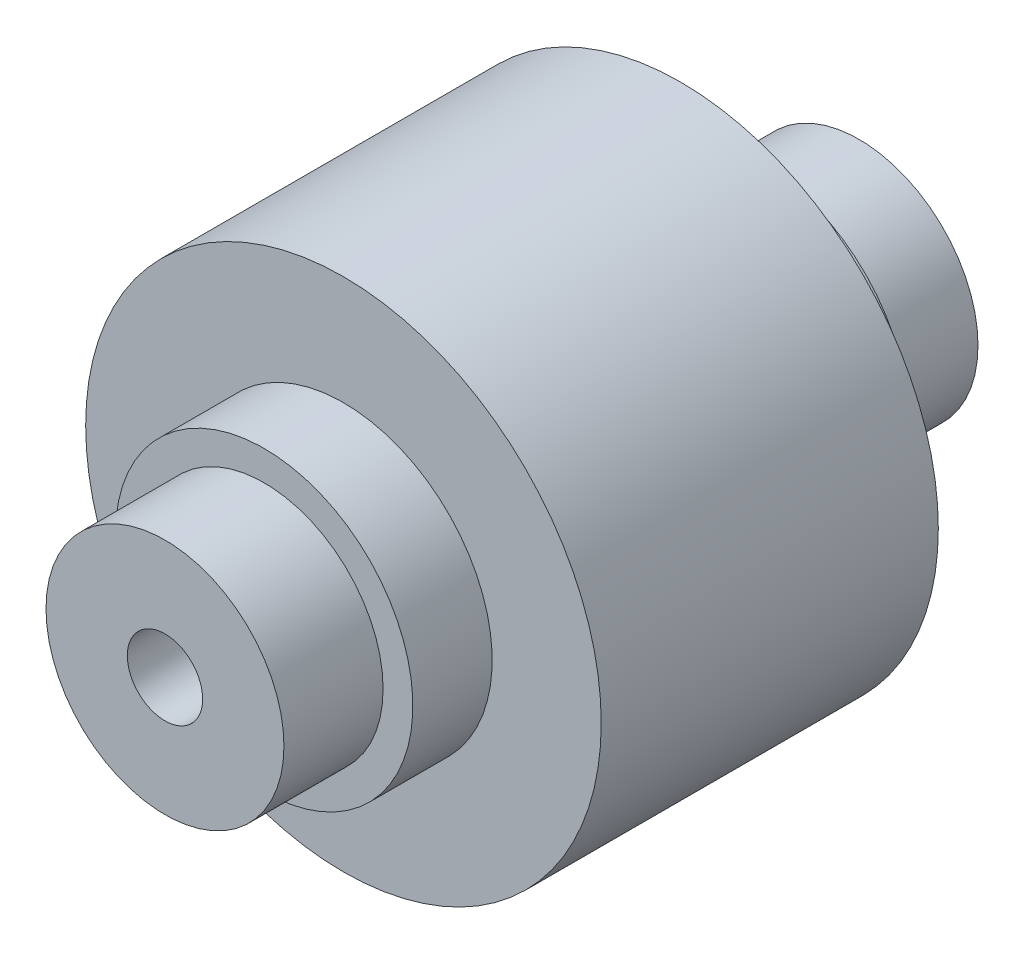
ISO-10303-21;
HEADER;
FILE_DESCRIPTION(('STEP AP214'),'2;1');
FILE_NAME('part.step','',(''),(''),'','','');
FILE_SCHEMA(('AUTOMOTIVE_DESIGN { 1 0 10303 214 1 1 1 1 }'));
ENDSEC;
DATA;
#1=APPLICATION_CONTEXT('core data for automotive mechanical design processes');
#2=APPLICATION_PROTOCOL_DEFINITION('international standard','automotive_design',2000,#1);
#3=PRODUCT_CONTEXT('',#1,'mechanical');
#4=PRODUCT('Part','Part','',(#3));
#5=PRODUCT_RELATED_PRODUCT_CATEGORY('part','',(#4));
#6=PRODUCT_DEFINITION_FORMATION('','',#4);
#7=PRODUCT_DEFINITION_CONTEXT('part definition',#1,'design');
#8=PRODUCT_DEFINITION('design','',#6,#7);
#9=PRODUCT_DEFINITION_SHAPE('','',#8);
#10=(LENGTH_UNIT() NAMED_UNIT(*) SI_UNIT(.MILLI.,.METRE.));
#11=(NAMED_UNIT(*) PLANE_ANGLE_UNIT() SI_UNIT($,.RADIAN.));
#12=(NAMED_UNIT(*) SI_UNIT($,.STERADIAN.) SOLID_ANGLE_UNIT());
#13=UNCERTAINTY_MEASURE_WITH_UNIT(LENGTH_MEASURE(1.E-05),#10,'distance_accuracy_value','');
#14=(GEOMETRIC_REPRESENTATION_CONTEXT(3) GLOBAL_UNCERTAINTY_ASSIGNED_CONTEXT((#13)) GLOBAL_UNIT_ASSIGNED_CONTEXT((#10,
#11,#12)) REPRESENTATION_CONTEXT('',''));
#15=CARTESIAN_POINT('',(0.,0.,0.));
#16=DIRECTION('',(0.,0.,1.));
#17=DIRECTION('',(1.,0.,0.));
#18=AXIS2_PLACEMENT_3D('',#15,#16,#17);
#19=CARTESIAN_POINT('',(6.00000000000001,0.,7.69072305839558E-10));
#20=DIRECTION('',(0.,0.,1.));
#21=DIRECTION('',(1.,0.,0.));
#22=AXIS2_PLACEMENT_3D('',#19,#20,#21);
#23=PLANE('',#22);
#24=CARTESIAN_POINT('',(0.,0.,7.69072305839558E-10));
#25=DIRECTION('',(0.,0.,1.));
#26=DIRECTION('',(1.,0.,0.));
#27=AXIS2_PLACEMENT_3D('',#24,#25,#26);
#28=CIRCLE('',#27,1.9);
#29=CARTESIAN_POINT('',(1.9,0.,7.69072305839558E-10));
#30=VERTEX_POINT('',#29);
#31=EDGE_CURVE('E69',#30,#30,#28,.T.);
#32=ORIENTED_EDGE('',*,*,#31,.T.);
#33=EDGE_LOOP('',(#32));
#34=FACE_BOUND('',#33,.T.);
#35=CARTESIAN_POINT('',(0.,0.,7.69072305839558E-10));
#36=DIRECTION('',(0.,0.,-1.));
#37=DIRECTION('',(-1.,0.,0.));
#38=AXIS2_PLACEMENT_3D('',#35,#36,#37);
#39=CIRCLE('',#38,5.99999999999999);
#40=CARTESIAN_POINT('',(-5.99999999999998,0.,7.69072305839558E-10));
#41=VERTEX_POINT('',#40);
#42=EDGE_CURVE('E66',#41,#41,#39,.T.);
#43=ORIENTED_EDGE('',*,*,#42,.T.);
#44=EDGE_LOOP('',(#43));
#45=FACE_BOUND('',#44,.T.);
#46=ADVANCED_FACE('F32',(#34,#45),#23,.F.);
#47=CARTESIAN_POINT('',(6.00000000000001,0.,35.0000000000258));
#48=DIRECTION('',(0.,0.,-1.));
#49=DIRECTION('',(-1.,0.,0.));
#50=AXIS2_PLACEMENT_3D('',#47,#48,#49);
#51=PLANE('',#50);
#52=CARTESIAN_POINT('',(0.,0.,35.0000000000258));
#53=DIRECTION('',(0.,0.,1.));
#54=DIRECTION('',(1.,0.,0.));
#55=AXIS2_PLACEMENT_3D('',#52,#53,#54);
#56=CIRCLE('',#55,1.9);
#57=CARTESIAN_POINT('',(1.9,0.,35.0000000000258));
#58=VERTEX_POINT('',#57);
#59=EDGE_CURVE('E72',#58,#58,#56,.T.);
#60=ORIENTED_EDGE('',*,*,#59,.F.);
#61=EDGE_LOOP('',(#60));
#62=FACE_BOUND('',#61,.T.);
#63=CARTESIAN_POINT('',(0.,0.,35.0000000000258));
#64=DIRECTION('',(0.,0.,-1.));
#65=DIRECTION('',(-1.,0.,0.));
#66=AXIS2_PLACEMENT_3D('',#63,#64,#65);
#67=CIRCLE('',#66,5.99999999999999);
#68=CARTESIAN_POINT('',(-5.99999999999998,0.,35.0000000000258));
#69=VERTEX_POINT('',#68);
#70=EDGE_CURVE('E10',#69,#69,#67,.T.);
#71=ORIENTED_EDGE('',*,*,#70,.F.);
#72=EDGE_LOOP('',(#71));
#73=FACE_BOUND('',#72,.T.);
#74=ADVANCED_FACE('F79',(#62,#73),#51,.F.);
#75=CARTESIAN_POINT('',(0.,0.,7.69072305839558E-10));
#76=DIRECTION('',(0.,0.,-1.));
#77=DIRECTION('',(-1.,0.,0.));
#78=AXIS2_PLACEMENT_3D('',#75,#76,#77);
#79=CYLINDRICAL_SURFACE('',#78,5.99999999999999);
#80=CARTESIAN_POINT('',(0.,0.,30.0000000003974));
#81=DIRECTION('',(0.,0.,-1.));
#82=DIRECTION('',(-1.,0.,0.));
#83=AXIS2_PLACEMENT_3D('',#80,#81,#82);
#84=CIRCLE('',#83,5.99999999999999);
#85=CARTESIAN_POINT('',(-5.99999999999998,0.,30.0000000003974));
#86=VERTEX_POINT('',#85);
#87=EDGE_CURVE('E38',#86,#86,#84,.T.);
#88=ORIENTED_EDGE('',*,*,#87,.F.);
#89=EDGE_LOOP('',(#88));
#90=FACE_BOUND('',#89,.T.);
#91=ORIENTED_EDGE('',*,*,#70,.T.);
#92=EDGE_LOOP('',(#91));
#93=FACE_BOUND('',#92,.T.);
#94=ADVANCED_FACE('F82',(#90,#93),#79,.T.);
#95=CARTESIAN_POINT('',(7.50000000000001,0.,30.0000000003974));
#96=DIRECTION('',(0.,0.,-1.));
#97=DIRECTION('',(-1.,0.,0.));
#98=AXIS2_PLACEMENT_3D('',#95,#96,#97);
#99=PLANE('',#98);
#100=CARTESIAN_POINT('',(0.,0.,30.0000000003974));
#101=DIRECTION('',(0.,0.,-1.));
#102=DIRECTION('',(-1.,0.,0.));
#103=AXIS2_PLACEMENT_3D('',#100,#101,#102);
#104=CIRCLE('',#103,7.5);
#105=CARTESIAN_POINT('',(-7.49999999999998,0.,30.0000000003974));
#106=VERTEX_POINT('',#105);
#107=EDGE_CURVE('E42',#106,#106,#104,.T.);
#108=ORIENTED_EDGE('',*,*,#107,.F.);
#109=EDGE_LOOP('',(#108));
#110=FACE_BOUND('',#109,.T.);
#111=ORIENTED_EDGE('',*,*,#87,.T.);
#112=EDGE_LOOP('',(#111));
#113=FACE_BOUND('',#112,.T.);
#114=ADVANCED_FACE('F87',(#110,#113),#99,.F.);
#115=CARTESIAN_POINT('',(0.,0.,7.69072305839558E-10));
#116=DIRECTION('',(0.,0.,-1.));
#117=DIRECTION('',(-1.,0.,0.));
#118=AXIS2_PLACEMENT_3D('',#115,#116,#117);
#119=CYLINDRICAL_SURFACE('',#118,7.5);
#120=CARTESIAN_POINT('',(0.,0.,26.0000000003974));
#121=DIRECTION('',(0.,0.,-1.));
#122=DIRECTION('',(-1.,0.,0.));
#123=AXIS2_PLACEMENT_3D('',#120,#121,#122);
#124=CIRCLE('',#123,7.5);
#125=CARTESIAN_POINT('',(-7.49999999999998,0.,26.0000000003974));
#126=VERTEX_POINT('',#125);
#127=EDGE_CURVE('E46',#126,#126,#124,.T.);
#128=ORIENTED_EDGE('',*,*,#127,.F.);
#129=EDGE_LOOP('',(#128));
#130=FACE_BOUND('',#129,.T.);
#131=ORIENTED_EDGE('',*,*,#107,.T.);
#132=EDGE_LOOP('',(#131));
#133=FACE_BOUND('',#132,.T.);
#134=ADVANCED_FACE('F94',(#130,#133),#119,.T.);
#135=CARTESIAN_POINT('',(9.00000000000001,0.,26.0000000003974));
#136=DIRECTION('',(0.,0.,-1.));
#137=DIRECTION('',(-1.,0.,0.));
#138=AXIS2_PLACEMENT_3D('',#135,#136,#137);
#139=PLANE('',#138);
#140=CARTESIAN_POINT('',(0.,0.,26.0000000003974));
#141=DIRECTION('',(0.,0.,-1.));
#142=DIRECTION('',(-1.,0.,0.));
#143=AXIS2_PLACEMENT_3D('',#140,#141,#142);
#144=CIRCLE('',#143,13.);
#145=CARTESIAN_POINT('',(-13.,0.,26.0000000003974));
#146=VERTEX_POINT('',#145);
#147=EDGE_CURVE('E51',#146,#146,#144,.T.);
#148=ORIENTED_EDGE('',*,*,#147,.F.);
#149=EDGE_LOOP('',(#148));
#150=FACE_BOUND('',#149,.T.);
#151=ORIENTED_EDGE('',*,*,#127,.T.);
#152=EDGE_LOOP('',(#151));
#153=FACE_BOUND('',#152,.T.);
#154=ADVANCED_FACE('F98',(#150,#153),#139,.F.);
#155=CARTESIAN_POINT('',(0.,0.,7.69072305839558E-10));
#156=DIRECTION('',(0.,0.,-1.));
#157=DIRECTION('',(-1.,0.,0.));
#158=AXIS2_PLACEMENT_3D('',#155,#156,#157);
#159=CYLINDRICAL_SURFACE('',#158,13.);
#160=CARTESIAN_POINT('',(0.,0.,9.00000000039744));
#161=DIRECTION('',(0.,0.,-1.));
#162=DIRECTION('',(-1.,0.,0.));
#163=AXIS2_PLACEMENT_3D('',#160,#161,#162);
#164=CIRCLE('',#163,13.);
#165=CARTESIAN_POINT('',(-13.,0.,9.00000000039744));
#166=VERTEX_POINT('',#165);
#167=EDGE_CURVE('E54',#166,#166,#164,.T.);
#168=ORIENTED_EDGE('',*,*,#167,.F.);
#169=EDGE_LOOP('',(#168));
#170=FACE_BOUND('',#169,.T.);
#171=ORIENTED_EDGE('',*,*,#147,.T.);
#172=EDGE_LOOP('',(#171));
#173=FACE_BOUND('',#172,.T.);
#174=ADVANCED_FACE('F102',(#170,#173),#159,.T.);
#175=CARTESIAN_POINT('',(9.00000000000001,0.,9.00000000039745));
#176=DIRECTION('',(0.,0.,1.));
#177=DIRECTION('',(1.,0.,0.));
#178=AXIS2_PLACEMENT_3D('',#175,#176,#177);
#179=PLANE('',#178);
#180=CARTESIAN_POINT('',(0.,0.,9.00000000039745));
#181=DIRECTION('',(0.,0.,-1.));
#182=DIRECTION('',(-1.,0.,0.));
#183=AXIS2_PLACEMENT_3D('',#180,#181,#182);
#184=CIRCLE('',#183,7.5);
#185=CARTESIAN_POINT('',(-7.49999999999998,0.,9.00000000039745));
#186=VERTEX_POINT('',#185);
#187=EDGE_CURVE('E57',#186,#186,#184,.T.);
#188=ORIENTED_EDGE('',*,*,#187,.F.);
#189=EDGE_LOOP('',(#188));
#190=FACE_BOUND('',#189,.T.);
#191=ORIENTED_EDGE('',*,*,#167,.T.);
#192=EDGE_LOOP('',(#191));
#193=FACE_BOUND('',#192,.T.);
#194=ADVANCED_FACE('F106',(#190,#193),#179,.F.);
#195=CARTESIAN_POINT('',(0.,0.,7.69072305839558E-10));
#196=DIRECTION('',(0.,0.,-1.));
#197=DIRECTION('',(-1.,0.,0.));
#198=AXIS2_PLACEMENT_3D('',#195,#196,#197);
#199=CYLINDRICAL_SURFACE('',#198,7.49999999999999);
#200=CARTESIAN_POINT('',(0.,0.,5.00000000039745));
#201=DIRECTION('',(0.,0.,-1.));
#202=DIRECTION('',(-1.,0.,0.));
#203=AXIS2_PLACEMENT_3D('',#200,#201,#202);
#204=CIRCLE('',#203,7.49999999999999);
#205=CARTESIAN_POINT('',(-7.49999999999998,0.,5.00000000039745));
#206=VERTEX_POINT('',#205);
#207=EDGE_CURVE('E60',#206,#206,#204,.T.);
#208=ORIENTED_EDGE('',*,*,#207,.F.);
#209=EDGE_LOOP('',(#208));
#210=FACE_BOUND('',#209,.T.);
#211=ORIENTED_EDGE('',*,*,#187,.T.);
#212=EDGE_LOOP('',(#211));
#213=FACE_BOUND('',#212,.T.);
#214=ADVANCED_FACE('F110',(#210,#213),#199,.T.);
#215=CARTESIAN_POINT('',(7.50000000000001,0.,5.00000000039745));
#216=DIRECTION('',(0.,0.,1.));
#217=DIRECTION('',(1.,0.,0.));
#218=AXIS2_PLACEMENT_3D('',#215,#216,#217);
#219=PLANE('',#218);
#220=CARTESIAN_POINT('',(0.,0.,5.00000000039745));
#221=DIRECTION('',(0.,0.,-1.));
#222=DIRECTION('',(-1.,0.,0.));
#223=AXIS2_PLACEMENT_3D('',#220,#221,#222);
#224=CIRCLE('',#223,5.99999999999999);
#225=CARTESIAN_POINT('',(-5.99999999999998,0.,5.00000000039745));
#226=VERTEX_POINT('',#225);
#227=EDGE_CURVE('E63',#226,#226,#224,.T.);
#228=ORIENTED_EDGE('',*,*,#227,.F.);
#229=EDGE_LOOP('',(#228));
#230=FACE_BOUND('',#229,.T.);
#231=ORIENTED_EDGE('',*,*,#207,.T.);
#232=EDGE_LOOP('',(#231));
#233=FACE_BOUND('',#232,.T.);
#234=ADVANCED_FACE('F114',(#230,#233),#219,.F.);
#235=CARTESIAN_POINT('',(0.,0.,7.69072305839558E-10));
#236=DIRECTION('',(0.,0.,-1.));
#237=DIRECTION('',(-1.,0.,0.));
#238=AXIS2_PLACEMENT_3D('',#235,#236,#237);
#239=CYLINDRICAL_SURFACE('',#238,5.99999999999999);
#240=ORIENTED_EDGE('',*,*,#42,.F.);
#241=EDGE_LOOP('',(#240));
#242=FACE_BOUND('',#241,.T.);
#243=ORIENTED_EDGE('',*,*,#227,.T.);
#244=EDGE_LOOP('',(#243));
#245=FACE_BOUND('',#244,.T.);
#246=ADVANCED_FACE('F118',(#242,#245),#239,.T.);
#247=CARTESIAN_POINT('',(0.,0.,-0.999999999974265));
#248=DIRECTION('',(0.,0.,1.));
#249=DIRECTION('',(1.,0.,0.));
#250=AXIS2_PLACEMENT_3D('',#247,#248,#249);
#251=CYLINDRICAL_SURFACE('',#250,1.9);
#252=ORIENTED_EDGE('',*,*,#59,.T.);
#253=EDGE_LOOP('',(#252));
#254=FACE_BOUND('',#253,.T.);
#255=ORIENTED_EDGE('',*,*,#31,.F.);
#256=EDGE_LOOP('',(#255));
#257=FACE_BOUND('',#256,.T.);
#258=ADVANCED_FACE('F76',(#254,#257),#251,.F.);
#259=CLOSED_SHELL('',(#46,#74,#94,#114,#134,#154,#174,#194,#214,#234,#246,#258));
#260=MANIFOLD_SOLID_BREP('B2',#259);
#261=ADVANCED_BREP_SHAPE_REPRESENTATION('',(#18,#260),#14);
#262=SHAPE_DEFINITION_REPRESENTATION(#9,#261);
ENDSEC;
END-ISO-10303-21;
